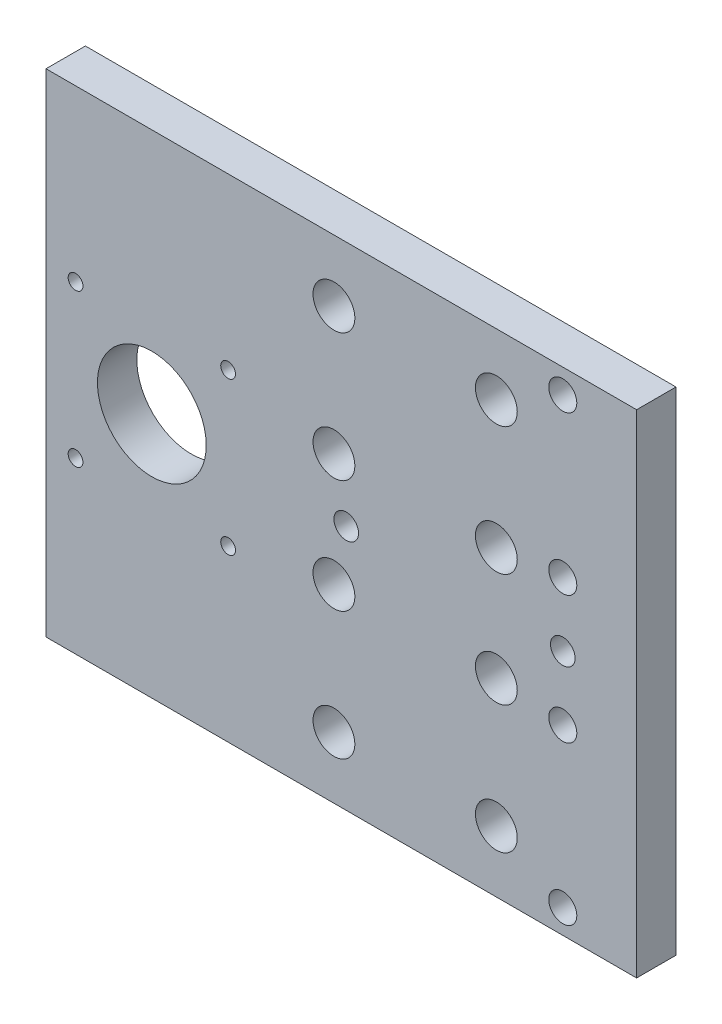
ISO-10303-21;
HEADER;
FILE_DESCRIPTION(('STEP AP214'),'2;1');
FILE_NAME('part.step','',(''),(''),'','','');
FILE_SCHEMA(('AUTOMOTIVE_DESIGN { 1 0 10303 214 1 1 1 1 }'));
ENDSEC;
DATA;
#1=APPLICATION_CONTEXT('core data for automotive mechanical design processes');
#2=APPLICATION_PROTOCOL_DEFINITION('international standard','automotive_design',2000,#1);
#3=PRODUCT_CONTEXT('',#1,'mechanical');
#4=PRODUCT('Part','Part','',(#3));
#5=PRODUCT_RELATED_PRODUCT_CATEGORY('part','',(#4));
#6=PRODUCT_DEFINITION_FORMATION('','',#4);
#7=PRODUCT_DEFINITION_CONTEXT('part definition',#1,'design');
#8=PRODUCT_DEFINITION('design','',#6,#7);
#9=PRODUCT_DEFINITION_SHAPE('','',#8);
#10=(LENGTH_UNIT() NAMED_UNIT(*) SI_UNIT(.MILLI.,.METRE.));
#11=(NAMED_UNIT(*) PLANE_ANGLE_UNIT() SI_UNIT($,.RADIAN.));
#12=(NAMED_UNIT(*) SI_UNIT($,.STERADIAN.) SOLID_ANGLE_UNIT());
#13=UNCERTAINTY_MEASURE_WITH_UNIT(LENGTH_MEASURE(1.E-05),#10,'distance_accuracy_value','');
#14=(GEOMETRIC_REPRESENTATION_CONTEXT(3) GLOBAL_UNCERTAINTY_ASSIGNED_CONTEXT((#13)) GLOBAL_UNIT_ASSIGNED_CONTEXT((#10,
#11,#12)) REPRESENTATION_CONTEXT('',''));
#15=CARTESIAN_POINT('',(0.,0.,0.));
#16=DIRECTION('',(0.,0.,1.));
#17=DIRECTION('',(1.,0.,0.));
#18=AXIS2_PLACEMENT_3D('',#15,#16,#17);
#19=CARTESIAN_POINT('',(-61.5,37.5,8.));
#20=DIRECTION('',(0.,0.,-1.));
#21=DIRECTION('',(-1.,0.,0.));
#22=AXIS2_PLACEMENT_3D('',#19,#20,#21);
#23=CYLINDRICAL_SURFACE('',#22,2.5);
#24=CARTESIAN_POINT('',(-61.5,37.5,0.));
#25=DIRECTION('',(0.,0.,1.));
#26=DIRECTION('',(1.,0.,0.));
#27=AXIS2_PLACEMENT_3D('',#24,#25,#26);
#28=CIRCLE('',#27,2.5);
#29=CARTESIAN_POINT('',(-59.,37.5,0.));
#30=VERTEX_POINT('',#29);
#31=EDGE_CURVE('E202',#30,#30,#28,.T.);
#32=ORIENTED_EDGE('',*,*,#31,.F.);
#33=EDGE_LOOP('',(#32));
#34=FACE_BOUND('',#33,.T.);
#35=CARTESIAN_POINT('',(-61.5,37.5,2.));
#36=DIRECTION('',(0.,0.,1.));
#37=DIRECTION('',(1.,0.,0.));
#38=AXIS2_PLACEMENT_3D('',#35,#36,#37);
#39=CIRCLE('',#38,2.5);
#40=CARTESIAN_POINT('',(-59.,37.5,2.));
#41=VERTEX_POINT('',#40);
#42=EDGE_CURVE('E39',#41,#41,#39,.T.);
#43=ORIENTED_EDGE('',*,*,#42,.T.);
#44=EDGE_LOOP('',(#43));
#45=FACE_BOUND('',#44,.T.);
#46=ADVANCED_FACE('F35',(#34,#45),#23,.F.);
#47=CARTESIAN_POINT('',(-28.5,37.5,8.));
#48=DIRECTION('',(0.,0.,-1.));
#49=DIRECTION('',(-1.,0.,0.));
#50=AXIS2_PLACEMENT_3D('',#47,#48,#49);
#51=CYLINDRICAL_SURFACE('',#50,2.5);
#52=CARTESIAN_POINT('',(-28.5,37.5,0.));
#53=DIRECTION('',(0.,0.,1.));
#54=DIRECTION('',(1.,0.,0.));
#55=AXIS2_PLACEMENT_3D('',#52,#53,#54);
#56=CIRCLE('',#55,2.5);
#57=CARTESIAN_POINT('',(-26.,37.5,0.));
#58=VERTEX_POINT('',#57);
#59=EDGE_CURVE('E199',#58,#58,#56,.T.);
#60=ORIENTED_EDGE('',*,*,#59,.F.);
#61=EDGE_LOOP('',(#60));
#62=FACE_BOUND('',#61,.T.);
#63=CARTESIAN_POINT('',(-28.5,37.5,2.));
#64=DIRECTION('',(0.,0.,1.));
#65=DIRECTION('',(1.,0.,0.));
#66=AXIS2_PLACEMENT_3D('',#63,#64,#65);
#67=CIRCLE('',#66,2.5);
#68=CARTESIAN_POINT('',(-26.,37.5,2.));
#69=VERTEX_POINT('',#68);
#70=EDGE_CURVE('E121',#69,#69,#67,.T.);
#71=ORIENTED_EDGE('',*,*,#70,.T.);
#72=EDGE_LOOP('',(#71));
#73=FACE_BOUND('',#72,.T.);
#74=ADVANCED_FACE('F251',(#62,#73),#51,.F.);
#75=CARTESIAN_POINT('',(-61.5,11.5,8.));
#76=DIRECTION('',(0.,0.,-1.));
#77=DIRECTION('',(-1.,0.,0.));
#78=AXIS2_PLACEMENT_3D('',#75,#76,#77);
#79=CYLINDRICAL_SURFACE('',#78,2.5);
#80=CARTESIAN_POINT('',(-61.5,11.5,0.));
#81=DIRECTION('',(0.,0.,1.));
#82=DIRECTION('',(1.,0.,0.));
#83=AXIS2_PLACEMENT_3D('',#80,#81,#82);
#84=CIRCLE('',#83,2.5);
#85=CARTESIAN_POINT('',(-59.,11.5,0.));
#86=VERTEX_POINT('',#85);
#87=EDGE_CURVE('E196',#86,#86,#84,.T.);
#88=ORIENTED_EDGE('',*,*,#87,.F.);
#89=EDGE_LOOP('',(#88));
#90=FACE_BOUND('',#89,.T.);
#91=CARTESIAN_POINT('',(-61.5,11.5,2.));
#92=DIRECTION('',(0.,0.,1.));
#93=DIRECTION('',(1.,0.,0.));
#94=AXIS2_PLACEMENT_3D('',#91,#92,#93);
#95=CIRCLE('',#94,2.5);
#96=CARTESIAN_POINT('',(-59.,11.5,2.));
#97=VERTEX_POINT('',#96);
#98=EDGE_CURVE('E119',#97,#97,#95,.T.);
#99=ORIENTED_EDGE('',*,*,#98,.T.);
#100=EDGE_LOOP('',(#99));
#101=FACE_BOUND('',#100,.T.);
#102=ADVANCED_FACE('F258',(#90,#101),#79,.F.);
#103=CARTESIAN_POINT('',(-28.5,11.5,8.));
#104=DIRECTION('',(0.,0.,-1.));
#105=DIRECTION('',(-1.,0.,0.));
#106=AXIS2_PLACEMENT_3D('',#103,#104,#105);
#107=CYLINDRICAL_SURFACE('',#106,2.5);
#108=CARTESIAN_POINT('',(-28.5,11.5,0.));
#109=DIRECTION('',(0.,0.,1.));
#110=DIRECTION('',(1.,0.,0.));
#111=AXIS2_PLACEMENT_3D('',#108,#109,#110);
#112=CIRCLE('',#111,2.5);
#113=CARTESIAN_POINT('',(-26.,11.5,0.));
#114=VERTEX_POINT('',#113);
#115=EDGE_CURVE('E193',#114,#114,#112,.T.);
#116=ORIENTED_EDGE('',*,*,#115,.F.);
#117=EDGE_LOOP('',(#116));
#118=FACE_BOUND('',#117,.T.);
#119=CARTESIAN_POINT('',(-28.5,11.5,2.));
#120=DIRECTION('',(0.,0.,1.));
#121=DIRECTION('',(1.,0.,0.));
#122=AXIS2_PLACEMENT_3D('',#119,#120,#121);
#123=CIRCLE('',#122,2.5);
#124=CARTESIAN_POINT('',(-26.,11.5,2.));
#125=VERTEX_POINT('',#124);
#126=EDGE_CURVE('E116',#125,#125,#123,.T.);
#127=ORIENTED_EDGE('',*,*,#126,.T.);
#128=EDGE_LOOP('',(#127));
#129=FACE_BOUND('',#128,.T.);
#130=ADVANCED_FACE('F349',(#118,#129),#107,.F.);
#131=CARTESIAN_POINT('',(-61.5,-11.5,8.));
#132=DIRECTION('',(0.,0.,-1.));
#133=DIRECTION('',(-1.,0.,0.));
#134=AXIS2_PLACEMENT_3D('',#131,#132,#133);
#135=CYLINDRICAL_SURFACE('',#134,2.5);
#136=CARTESIAN_POINT('',(-61.5,-11.5,0.));
#137=DIRECTION('',(0.,0.,1.));
#138=DIRECTION('',(1.,0.,0.));
#139=AXIS2_PLACEMENT_3D('',#136,#137,#138);
#140=CIRCLE('',#139,2.5);
#141=CARTESIAN_POINT('',(-59.,-11.5,0.));
#142=VERTEX_POINT('',#141);
#143=EDGE_CURVE('E190',#142,#142,#140,.T.);
#144=ORIENTED_EDGE('',*,*,#143,.F.);
#145=EDGE_LOOP('',(#144));
#146=FACE_BOUND('',#145,.T.);
#147=CARTESIAN_POINT('',(-61.5,-11.5,2.));
#148=DIRECTION('',(0.,0.,1.));
#149=DIRECTION('',(1.,0.,0.));
#150=AXIS2_PLACEMENT_3D('',#147,#148,#149);
#151=CIRCLE('',#150,2.5);
#152=CARTESIAN_POINT('',(-59.,-11.5,2.));
#153=VERTEX_POINT('',#152);
#154=EDGE_CURVE('E113',#153,#153,#151,.T.);
#155=ORIENTED_EDGE('',*,*,#154,.T.);
#156=EDGE_LOOP('',(#155));
#157=FACE_BOUND('',#156,.T.);
#158=ADVANCED_FACE('F345',(#146,#157),#135,.F.);
#159=CARTESIAN_POINT('',(-28.5,-11.5,8.));
#160=DIRECTION('',(0.,0.,-1.));
#161=DIRECTION('',(-1.,0.,0.));
#162=AXIS2_PLACEMENT_3D('',#159,#160,#161);
#163=CYLINDRICAL_SURFACE('',#162,2.5);
#164=CARTESIAN_POINT('',(-28.5,-11.5,0.));
#165=DIRECTION('',(0.,0.,1.));
#166=DIRECTION('',(1.,0.,0.));
#167=AXIS2_PLACEMENT_3D('',#164,#165,#166);
#168=CIRCLE('',#167,2.5);
#169=CARTESIAN_POINT('',(-26.,-11.5,0.));
#170=VERTEX_POINT('',#169);
#171=EDGE_CURVE('E187',#170,#170,#168,.T.);
#172=ORIENTED_EDGE('',*,*,#171,.F.);
#173=EDGE_LOOP('',(#172));
#174=FACE_BOUND('',#173,.T.);
#175=CARTESIAN_POINT('',(-28.5,-11.5,2.));
#176=DIRECTION('',(0.,0.,1.));
#177=DIRECTION('',(1.,0.,0.));
#178=AXIS2_PLACEMENT_3D('',#175,#176,#177);
#179=CIRCLE('',#178,2.5);
#180=CARTESIAN_POINT('',(-26.,-11.5,2.));
#181=VERTEX_POINT('',#180);
#182=EDGE_CURVE('E110',#181,#181,#179,.T.);
#183=ORIENTED_EDGE('',*,*,#182,.T.);
#184=EDGE_LOOP('',(#183));
#185=FACE_BOUND('',#184,.T.);
#186=ADVANCED_FACE('F341',(#174,#185),#163,.F.);
#187=CARTESIAN_POINT('',(-28.5,-37.5,8.));
#188=DIRECTION('',(0.,0.,-1.));
#189=DIRECTION('',(-1.,0.,0.));
#190=AXIS2_PLACEMENT_3D('',#187,#188,#189);
#191=CYLINDRICAL_SURFACE('',#190,2.5);
#192=CARTESIAN_POINT('',(-28.5,-37.5,0.));
#193=DIRECTION('',(0.,0.,1.));
#194=DIRECTION('',(1.,0.,0.));
#195=AXIS2_PLACEMENT_3D('',#192,#193,#194);
#196=CIRCLE('',#195,2.5);
#197=CARTESIAN_POINT('',(-26.,-37.5,0.));
#198=VERTEX_POINT('',#197);
#199=EDGE_CURVE('E184',#198,#198,#196,.T.);
#200=ORIENTED_EDGE('',*,*,#199,.F.);
#201=EDGE_LOOP('',(#200));
#202=FACE_BOUND('',#201,.T.);
#203=CARTESIAN_POINT('',(-28.5,-37.5,2.));
#204=DIRECTION('',(0.,0.,1.));
#205=DIRECTION('',(1.,0.,0.));
#206=AXIS2_PLACEMENT_3D('',#203,#204,#205);
#207=CIRCLE('',#206,2.5);
#208=CARTESIAN_POINT('',(-26.,-37.5,2.));
#209=VERTEX_POINT('',#208);
#210=EDGE_CURVE('E106',#209,#209,#207,.T.);
#211=ORIENTED_EDGE('',*,*,#210,.T.);
#212=EDGE_LOOP('',(#211));
#213=FACE_BOUND('',#212,.T.);
#214=ADVANCED_FACE('F337',(#202,#213),#191,.F.);
#215=CARTESIAN_POINT('',(-61.5,-37.5,8.));
#216=DIRECTION('',(0.,0.,-1.));
#217=DIRECTION('',(-1.,0.,0.));
#218=AXIS2_PLACEMENT_3D('',#215,#216,#217);
#219=CYLINDRICAL_SURFACE('',#218,2.5);
#220=CARTESIAN_POINT('',(-61.5,-37.5,0.));
#221=DIRECTION('',(0.,0.,1.));
#222=DIRECTION('',(1.,0.,0.));
#223=AXIS2_PLACEMENT_3D('',#220,#221,#222);
#224=CIRCLE('',#223,2.5);
#225=CARTESIAN_POINT('',(-59.,-37.5,0.));
#226=VERTEX_POINT('',#225);
#227=EDGE_CURVE('E179',#226,#226,#224,.T.);
#228=ORIENTED_EDGE('',*,*,#227,.F.);
#229=EDGE_LOOP('',(#228));
#230=FACE_BOUND('',#229,.T.);
#231=CARTESIAN_POINT('',(-61.5,-37.5,2.));
#232=DIRECTION('',(0.,0.,1.));
#233=DIRECTION('',(1.,0.,0.));
#234=AXIS2_PLACEMENT_3D('',#231,#232,#233);
#235=CIRCLE('',#234,2.5);
#236=CARTESIAN_POINT('',(-59.,-37.5,2.));
#237=VERTEX_POINT('',#236);
#238=EDGE_CURVE('E103',#237,#237,#235,.T.);
#239=ORIENTED_EDGE('',*,*,#238,.T.);
#240=EDGE_LOOP('',(#239));
#241=FACE_BOUND('',#240,.T.);
#242=ADVANCED_FACE('F334',(#230,#241),#219,.F.);
#243=CARTESIAN_POINT('',(0.,0.,8.));
#244=DIRECTION('',(0.,0.,1.));
#245=DIRECTION('',(1.,0.,0.));
#246=AXIS2_PLACEMENT_3D('',#243,#244,#245);
#247=PLANE('',#246);
#248=CARTESIAN_POINT('',(-15.,0.,8.));
#249=DIRECTION('',(0.,0.,1.));
#250=DIRECTION('',(1.,0.,0.));
#251=AXIS2_PLACEMENT_3D('',#248,#249,#250);
#252=CIRCLE('',#251,2.5);
#253=CARTESIAN_POINT('',(-12.5,0.,8.));
#254=VERTEX_POINT('',#253);
#255=EDGE_CURVE('E414',#254,#254,#252,.T.);
#256=ORIENTED_EDGE('',*,*,#255,.F.);
#257=EDGE_LOOP('',(#256));
#258=FACE_BOUND('',#257,.T.);
#259=CARTESIAN_POINT('',(-59.,0.,8.));
#260=DIRECTION('',(0.,0.,1.));
#261=DIRECTION('',(1.,0.,0.));
#262=AXIS2_PLACEMENT_3D('',#259,#260,#261);
#263=CIRCLE('',#262,2.5);
#264=CARTESIAN_POINT('',(-56.5,0.,8.));
#265=VERTEX_POINT('',#264);
#266=EDGE_CURVE('E408',#265,#265,#263,.T.);
#267=ORIENTED_EDGE('',*,*,#266,.F.);
#268=EDGE_LOOP('',(#267));
#269=FACE_BOUND('',#268,.T.);
#270=CARTESIAN_POINT('',(-61.5,-11.5,8.));
#271=DIRECTION('',(0.,0.,1.));
#272=DIRECTION('',(1.,0.,0.));
#273=AXIS2_PLACEMENT_3D('',#270,#271,#272);
#274=CIRCLE('',#273,4.25000000000001);
#275=CARTESIAN_POINT('',(-57.25,-11.5,8.));
#276=VERTEX_POINT('',#275);
#277=EDGE_CURVE('E378',#276,#276,#274,.T.);
#278=ORIENTED_EDGE('',*,*,#277,.F.);
#279=EDGE_LOOP('',(#278));
#280=FACE_BOUND('',#279,.T.);
#281=CARTESIAN_POINT('',(-28.5,11.5,8.));
#282=DIRECTION('',(0.,0.,1.));
#283=DIRECTION('',(1.,0.,0.));
#284=AXIS2_PLACEMENT_3D('',#281,#282,#283);
#285=CIRCLE('',#284,4.25);
#286=CARTESIAN_POINT('',(-24.25,11.5,8.));
#287=VERTEX_POINT('',#286);
#288=EDGE_CURVE('E385',#287,#287,#285,.T.);
#289=ORIENTED_EDGE('',*,*,#288,.F.);
#290=EDGE_LOOP('',(#289));
#291=FACE_BOUND('',#290,.T.);
#292=CARTESIAN_POINT('',(-61.5,11.5,8.));
#293=DIRECTION('',(0.,0.,1.));
#294=DIRECTION('',(1.,0.,0.));
#295=AXIS2_PLACEMENT_3D('',#292,#293,#294);
#296=CIRCLE('',#295,4.25000000000001);
#297=CARTESIAN_POINT('',(-57.25,11.5,8.));
#298=VERTEX_POINT('',#297);
#299=EDGE_CURVE('E144',#298,#298,#296,.T.);
#300=ORIENTED_EDGE('',*,*,#299,.F.);
#301=EDGE_LOOP('',(#300));
#302=FACE_BOUND('',#301,.T.);
#303=CARTESIAN_POINT('',(-28.5,37.5,8.));
#304=DIRECTION('',(0.,0.,1.));
#305=DIRECTION('',(1.,0.,0.));
#306=AXIS2_PLACEMENT_3D('',#303,#304,#305);
#307=CIRCLE('',#306,4.25);
#308=CARTESIAN_POINT('',(-24.25,37.5,8.));
#309=VERTEX_POINT('',#308);
#310=EDGE_CURVE('E370',#309,#309,#307,.T.);
#311=ORIENTED_EDGE('',*,*,#310,.F.);
#312=EDGE_LOOP('',(#311));
#313=FACE_BOUND('',#312,.T.);
#314=CARTESIAN_POINT('',(-28.5,-37.5,8.));
#315=DIRECTION('',(0.,0.,1.));
#316=DIRECTION('',(1.,0.,0.));
#317=AXIS2_PLACEMENT_3D('',#314,#315,#316);
#318=CIRCLE('',#317,4.25);
#319=CARTESIAN_POINT('',(-24.25,-37.5,8.));
#320=VERTEX_POINT('',#319);
#321=EDGE_CURVE('E402',#320,#320,#318,.T.);
#322=ORIENTED_EDGE('',*,*,#321,.F.);
#323=EDGE_LOOP('',(#322));
#324=FACE_BOUND('',#323,.T.);
#325=CARTESIAN_POINT('',(-61.5,-37.5,8.));
#326=DIRECTION('',(0.,0.,1.));
#327=DIRECTION('',(1.,0.,0.));
#328=AXIS2_PLACEMENT_3D('',#325,#326,#327);
#329=CIRCLE('',#328,4.25000000000001);
#330=CARTESIAN_POINT('',(-57.25,-37.5,8.));
#331=VERTEX_POINT('',#330);
#332=EDGE_CURVE('E390',#331,#331,#329,.T.);
#333=ORIENTED_EDGE('',*,*,#332,.F.);
#334=EDGE_LOOP('',(#333));
#335=FACE_BOUND('',#334,.T.);
#336=CARTESIAN_POINT('',(-28.5,-11.5,8.));
#337=DIRECTION('',(0.,0.,1.));
#338=DIRECTION('',(1.,0.,0.));
#339=AXIS2_PLACEMENT_3D('',#336,#337,#338);
#340=CIRCLE('',#339,4.25);
#341=CARTESIAN_POINT('',(-24.25,-11.5,8.));
#342=VERTEX_POINT('',#341);
#343=EDGE_CURVE('E397',#342,#342,#340,.T.);
#344=ORIENTED_EDGE('',*,*,#343,.F.);
#345=EDGE_LOOP('',(#344));
#346=FACE_BOUND('',#345,.T.);
#347=CARTESIAN_POINT('',(-61.5,37.5,8.));
#348=DIRECTION('',(0.,0.,1.));
#349=DIRECTION('',(1.,0.,0.));
#350=AXIS2_PLACEMENT_3D('',#347,#348,#349);
#351=CIRCLE('',#350,4.25000000000001);
#352=CARTESIAN_POINT('',(-57.25,37.5,8.));
#353=VERTEX_POINT('',#352);
#354=EDGE_CURVE('E138',#353,#353,#351,.T.);
#355=ORIENTED_EDGE('',*,*,#354,.F.);
#356=EDGE_LOOP('',(#355));
#357=FACE_BOUND('',#356,.T.);
#358=DIRECTION('',(1.,0.,0.));
#359=VECTOR('',#358,1.);
#360=CARTESIAN_POINT('',(-139.94109970655,50.,8.));
#361=LINE('',#360,#359);
#362=CARTESIAN_POINT('',(-120.,50.,8.));
#363=VERTEX_POINT('',#362);
#364=CARTESIAN_POINT('',(0.,50.,8.));
#365=VERTEX_POINT('',#364);
#366=EDGE_CURVE('E52',#363,#365,#361,.T.);
#367=ORIENTED_EDGE('',*,*,#366,.F.);
#368=DIRECTION('',(0.,-1.,0.));
#369=VECTOR('',#368,1.);
#370=CARTESIAN_POINT('',(-120.,60.,8.));
#371=LINE('',#370,#369);
#372=CARTESIAN_POINT('',(-120.,-50.,8.));
#373=VERTEX_POINT('',#372);
#374=EDGE_CURVE('E90',#363,#373,#371,.T.);
#375=ORIENTED_EDGE('',*,*,#374,.T.);
#376=DIRECTION('',(-1.,0.,0.));
#377=VECTOR('',#376,1.);
#378=CARTESIAN_POINT('',(-139.94109970655,-50.,8.));
#379=LINE('',#378,#377);
#380=CARTESIAN_POINT('',(0.,-50.,8.));
#381=VERTEX_POINT('',#380);
#382=EDGE_CURVE('E76',#381,#373,#379,.T.);
#383=ORIENTED_EDGE('',*,*,#382,.F.);
#384=DIRECTION('',(0.,1.,0.));
#385=VECTOR('',#384,1.);
#386=CARTESIAN_POINT('',(0.,-60.,8.));
#387=LINE('',#386,#385);
#388=EDGE_CURVE('E82',#381,#365,#387,.T.);
#389=ORIENTED_EDGE('',*,*,#388,.T.);
#390=EDGE_LOOP('',(#367,#375,#383,#389));
#391=FACE_BOUND('',#390,.T.);
#392=CARTESIAN_POINT('',(-15.,-13.,8.));
#393=DIRECTION('',(0.,0.,1.));
#394=DIRECTION('',(1.,0.,0.));
#395=AXIS2_PLACEMENT_3D('',#392,#393,#394);
#396=CIRCLE('',#395,2.85);
#397=CARTESIAN_POINT('',(-12.15,-13.,8.));
#398=VERTEX_POINT('',#397);
#399=EDGE_CURVE('E164',#398,#398,#396,.T.);
#400=ORIENTED_EDGE('',*,*,#399,.F.);
#401=EDGE_LOOP('',(#400));
#402=FACE_BOUND('',#401,.T.);
#403=CARTESIAN_POINT('',(-15.,45.1,8.));
#404=DIRECTION('',(0.,0.,1.));
#405=DIRECTION('',(1.,0.,0.));
#406=AXIS2_PLACEMENT_3D('',#403,#404,#405);
#407=CIRCLE('',#406,2.85);
#408=CARTESIAN_POINT('',(-12.15,45.1,8.));
#409=VERTEX_POINT('',#408);
#410=EDGE_CURVE('E176',#409,#409,#407,.T.);
#411=ORIENTED_EDGE('',*,*,#410,.F.);
#412=EDGE_LOOP('',(#411));
#413=FACE_BOUND('',#412,.T.);
#414=CARTESIAN_POINT('',(-114.,-15.5,8.));
#415=DIRECTION('',(0.,0.,1.));
#416=DIRECTION('',(1.,0.,0.));
#417=AXIS2_PLACEMENT_3D('',#414,#415,#416);
#418=CIRCLE('',#417,1.5);
#419=CARTESIAN_POINT('',(-112.5,-15.5,8.));
#420=VERTEX_POINT('',#419);
#421=EDGE_CURVE('E212',#420,#420,#418,.T.);
#422=ORIENTED_EDGE('',*,*,#421,.F.);
#423=EDGE_LOOP('',(#422));
#424=FACE_BOUND('',#423,.T.);
#425=CARTESIAN_POINT('',(-83.,15.5,8.));
#426=DIRECTION('',(0.,0.,1.));
#427=DIRECTION('',(1.,0.,0.));
#428=AXIS2_PLACEMENT_3D('',#425,#426,#427);
#429=CIRCLE('',#428,1.5);
#430=CARTESIAN_POINT('',(-81.5,15.5,8.));
#431=VERTEX_POINT('',#430);
#432=EDGE_CURVE('E224',#431,#431,#429,.T.);
#433=ORIENTED_EDGE('',*,*,#432,.F.);
#434=EDGE_LOOP('',(#433));
#435=FACE_BOUND('',#434,.T.);
#436=CARTESIAN_POINT('',(-98.5,0.,8.));
#437=DIRECTION('',(0.,0.,1.));
#438=DIRECTION('',(1.,0.,0.));
#439=AXIS2_PLACEMENT_3D('',#436,#437,#438);
#440=CIRCLE('',#439,11.05);
#441=CARTESIAN_POINT('',(-87.45,0.,8.));
#442=VERTEX_POINT('',#441);
#443=EDGE_CURVE('E101',#442,#442,#440,.T.);
#444=ORIENTED_EDGE('',*,*,#443,.F.);
#445=EDGE_LOOP('',(#444));
#446=FACE_BOUND('',#445,.T.);
#447=CARTESIAN_POINT('',(-114.,15.5,8.));
#448=DIRECTION('',(0.,0.,1.));
#449=DIRECTION('',(1.,0.,0.));
#450=AXIS2_PLACEMENT_3D('',#447,#448,#449);
#451=CIRCLE('',#450,1.5);
#452=CARTESIAN_POINT('',(-112.5,15.5,8.));
#453=VERTEX_POINT('',#452);
#454=EDGE_CURVE('E218',#453,#453,#451,.T.);
#455=ORIENTED_EDGE('',*,*,#454,.F.);
#456=EDGE_LOOP('',(#455));
#457=FACE_BOUND('',#456,.T.);
#458=CARTESIAN_POINT('',(-83.,-15.5,8.));
#459=DIRECTION('',(0.,0.,1.));
#460=DIRECTION('',(1.,0.,0.));
#461=AXIS2_PLACEMENT_3D('',#458,#459,#460);
#462=CIRCLE('',#461,1.5);
#463=CARTESIAN_POINT('',(-81.5,-15.5,8.));
#464=VERTEX_POINT('',#463);
#465=EDGE_CURVE('E206',#464,#464,#462,.T.);
#466=ORIENTED_EDGE('',*,*,#465,.F.);
#467=EDGE_LOOP('',(#466));
#468=FACE_BOUND('',#467,.T.);
#469=CARTESIAN_POINT('',(-15.,13.,8.));
#470=DIRECTION('',(0.,0.,1.));
#471=DIRECTION('',(1.,0.,0.));
#472=AXIS2_PLACEMENT_3D('',#469,#470,#471);
#473=CIRCLE('',#472,2.85);
#474=CARTESIAN_POINT('',(-12.15,13.,8.));
#475=VERTEX_POINT('',#474);
#476=EDGE_CURVE('E170',#475,#475,#473,.T.);
#477=ORIENTED_EDGE('',*,*,#476,.F.);
#478=EDGE_LOOP('',(#477));
#479=FACE_BOUND('',#478,.T.);
#480=CARTESIAN_POINT('',(-15.,-45.1,8.));
#481=DIRECTION('',(0.,0.,1.));
#482=DIRECTION('',(1.,0.,0.));
#483=AXIS2_PLACEMENT_3D('',#480,#481,#482);
#484=CIRCLE('',#483,2.85);
#485=CARTESIAN_POINT('',(-12.15,-45.1,8.));
#486=VERTEX_POINT('',#485);
#487=EDGE_CURVE('E158',#486,#486,#484,.T.);
#488=ORIENTED_EDGE('',*,*,#487,.F.);
#489=EDGE_LOOP('',(#488));
#490=FACE_BOUND('',#489,.T.);
#491=ADVANCED_FACE('F87',(#258,#269,#280,#291,#302,#313,#324,#335,#346,#357,#391,#402,#413,#424,
#435,#446,#457,#468,#479,#490),#247,.T.);
#492=CARTESIAN_POINT('',(0.,0.,0.));
#493=DIRECTION('',(0.,0.,1.));
#494=DIRECTION('',(1.,0.,0.));
#495=AXIS2_PLACEMENT_3D('',#492,#493,#494);
#496=PLANE('',#495);
#497=CARTESIAN_POINT('',(-15.,0.,0.));
#498=DIRECTION('',(0.,0.,1.));
#499=DIRECTION('',(1.,0.,0.));
#500=AXIS2_PLACEMENT_3D('',#497,#498,#499);
#501=CIRCLE('',#500,2.5);
#502=CARTESIAN_POINT('',(-12.5,0.,0.));
#503=VERTEX_POINT('',#502);
#504=EDGE_CURVE('E405',#503,#503,#501,.T.);
#505=ORIENTED_EDGE('',*,*,#504,.T.);
#506=EDGE_LOOP('',(#505));
#507=FACE_BOUND('',#506,.T.);
#508=CARTESIAN_POINT('',(-59.,0.,0.));
#509=DIRECTION('',(0.,0.,1.));
#510=DIRECTION('',(1.,0.,0.));
#511=AXIS2_PLACEMENT_3D('',#508,#509,#510);
#512=CIRCLE('',#511,2.5);
#513=CARTESIAN_POINT('',(-56.5,0.,0.));
#514=VERTEX_POINT('',#513);
#515=EDGE_CURVE('E411',#514,#514,#512,.T.);
#516=ORIENTED_EDGE('',*,*,#515,.T.);
#517=EDGE_LOOP('',(#516));
#518=FACE_BOUND('',#517,.T.);
#519=DIRECTION('',(0.,-1.,0.));
#520=VECTOR('',#519,1.);
#521=CARTESIAN_POINT('',(-120.,60.,0.));
#522=LINE('',#521,#520);
#523=CARTESIAN_POINT('',(-120.,50.,0.));
#524=VERTEX_POINT('',#523);
#525=CARTESIAN_POINT('',(-120.,-50.,0.));
#526=VERTEX_POINT('',#525);
#527=EDGE_CURVE('E98',#524,#526,#522,.T.);
#528=ORIENTED_EDGE('',*,*,#527,.F.);
#529=DIRECTION('',(1.,0.,0.));
#530=VECTOR('',#529,1.);
#531=CARTESIAN_POINT('',(0.,50.,0.));
#532=LINE('',#531,#530);
#533=CARTESIAN_POINT('',(0.,50.,0.));
#534=VERTEX_POINT('',#533);
#535=EDGE_CURVE('E151',#524,#534,#532,.T.);
#536=ORIENTED_EDGE('',*,*,#535,.T.);
#537=DIRECTION('',(0.,1.,0.));
#538=VECTOR('',#537,1.);
#539=CARTESIAN_POINT('',(0.,-60.,0.));
#540=LINE('',#539,#538);
#541=CARTESIAN_POINT('',(0.,-50.,0.));
#542=VERTEX_POINT('',#541);
#543=EDGE_CURVE('E94',#542,#534,#540,.T.);
#544=ORIENTED_EDGE('',*,*,#543,.F.);
#545=DIRECTION('',(-1.,0.,0.));
#546=VECTOR('',#545,1.);
#547=CARTESIAN_POINT('',(0.,-50.,0.));
#548=LINE('',#547,#546);
#549=EDGE_CURVE('E59',#542,#526,#548,.T.);
#550=ORIENTED_EDGE('',*,*,#549,.T.);
#551=EDGE_LOOP('',(#528,#536,#544,#550));
#552=FACE_BOUND('',#551,.T.);
#553=CARTESIAN_POINT('',(-98.5,0.,0.));
#554=DIRECTION('',(0.,0.,1.));
#555=DIRECTION('',(1.,0.,0.));
#556=AXIS2_PLACEMENT_3D('',#553,#554,#555);
#557=CIRCLE('',#556,11.05);
#558=CARTESIAN_POINT('',(-87.45,0.,0.));
#559=VERTEX_POINT('',#558);
#560=EDGE_CURVE('E227',#559,#559,#557,.T.);
#561=ORIENTED_EDGE('',*,*,#560,.T.);
#562=EDGE_LOOP('',(#561));
#563=FACE_BOUND('',#562,.T.);
#564=CARTESIAN_POINT('',(-83.,15.5,0.));
#565=DIRECTION('',(0.,0.,1.));
#566=DIRECTION('',(1.,0.,0.));
#567=AXIS2_PLACEMENT_3D('',#564,#565,#566);
#568=CIRCLE('',#567,1.5);
#569=CARTESIAN_POINT('',(-81.5,15.5,0.));
#570=VERTEX_POINT('',#569);
#571=EDGE_CURVE('E221',#570,#570,#568,.T.);
#572=ORIENTED_EDGE('',*,*,#571,.T.);
#573=EDGE_LOOP('',(#572));
#574=FACE_BOUND('',#573,.T.);
#575=CARTESIAN_POINT('',(-114.,15.5,0.));
#576=DIRECTION('',(0.,0.,1.));
#577=DIRECTION('',(1.,0.,0.));
#578=AXIS2_PLACEMENT_3D('',#575,#576,#577);
#579=CIRCLE('',#578,1.5);
#580=CARTESIAN_POINT('',(-112.5,15.5,0.));
#581=VERTEX_POINT('',#580);
#582=EDGE_CURVE('E215',#581,#581,#579,.T.);
#583=ORIENTED_EDGE('',*,*,#582,.T.);
#584=EDGE_LOOP('',(#583));
#585=FACE_BOUND('',#584,.T.);
#586=CARTESIAN_POINT('',(-114.,-15.5,0.));
#587=DIRECTION('',(0.,0.,1.));
#588=DIRECTION('',(1.,0.,0.));
#589=AXIS2_PLACEMENT_3D('',#586,#587,#588);
#590=CIRCLE('',#589,1.5);
#591=CARTESIAN_POINT('',(-112.5,-15.5,0.));
#592=VERTEX_POINT('',#591);
#593=EDGE_CURVE('E209',#592,#592,#590,.T.);
#594=ORIENTED_EDGE('',*,*,#593,.T.);
#595=EDGE_LOOP('',(#594));
#596=FACE_BOUND('',#595,.T.);
#597=CARTESIAN_POINT('',(-83.,-15.5,0.));
#598=DIRECTION('',(0.,0.,1.));
#599=DIRECTION('',(1.,0.,0.));
#600=AXIS2_PLACEMENT_3D('',#597,#598,#599);
#601=CIRCLE('',#600,1.5);
#602=CARTESIAN_POINT('',(-81.5,-15.5,0.));
#603=VERTEX_POINT('',#602);
#604=EDGE_CURVE('E205',#603,#603,#601,.T.);
#605=ORIENTED_EDGE('',*,*,#604,.T.);
#606=EDGE_LOOP('',(#605));
#607=FACE_BOUND('',#606,.T.);
#608=ORIENTED_EDGE('',*,*,#31,.T.);
#609=EDGE_LOOP('',(#608));
#610=FACE_BOUND('',#609,.T.);
#611=ORIENTED_EDGE('',*,*,#59,.T.);
#612=EDGE_LOOP('',(#611));
#613=FACE_BOUND('',#612,.T.);
#614=ORIENTED_EDGE('',*,*,#87,.T.);
#615=EDGE_LOOP('',(#614));
#616=FACE_BOUND('',#615,.T.);
#617=ORIENTED_EDGE('',*,*,#115,.T.);
#618=EDGE_LOOP('',(#617));
#619=FACE_BOUND('',#618,.T.);
#620=ORIENTED_EDGE('',*,*,#143,.T.);
#621=EDGE_LOOP('',(#620));
#622=FACE_BOUND('',#621,.T.);
#623=ORIENTED_EDGE('',*,*,#171,.T.);
#624=EDGE_LOOP('',(#623));
#625=FACE_BOUND('',#624,.T.);
#626=ORIENTED_EDGE('',*,*,#199,.T.);
#627=EDGE_LOOP('',(#626));
#628=FACE_BOUND('',#627,.T.);
#629=ORIENTED_EDGE('',*,*,#227,.T.);
#630=EDGE_LOOP('',(#629));
#631=FACE_BOUND('',#630,.T.);
#632=CARTESIAN_POINT('',(-15.,45.1,0.));
#633=DIRECTION('',(0.,0.,1.));
#634=DIRECTION('',(1.,0.,0.));
#635=AXIS2_PLACEMENT_3D('',#632,#633,#634);
#636=CIRCLE('',#635,2.85);
#637=CARTESIAN_POINT('',(-12.15,45.1,0.));
#638=VERTEX_POINT('',#637);
#639=EDGE_CURVE('E173',#638,#638,#636,.T.);
#640=ORIENTED_EDGE('',*,*,#639,.T.);
#641=EDGE_LOOP('',(#640));
#642=FACE_BOUND('',#641,.T.);
#643=CARTESIAN_POINT('',(-15.,13.,0.));
#644=DIRECTION('',(0.,0.,1.));
#645=DIRECTION('',(1.,0.,0.));
#646=AXIS2_PLACEMENT_3D('',#643,#644,#645);
#647=CIRCLE('',#646,2.85);
#648=CARTESIAN_POINT('',(-12.15,13.,0.));
#649=VERTEX_POINT('',#648);
#650=EDGE_CURVE('E167',#649,#649,#647,.T.);
#651=ORIENTED_EDGE('',*,*,#650,.T.);
#652=EDGE_LOOP('',(#651));
#653=FACE_BOUND('',#652,.T.);
#654=CARTESIAN_POINT('',(-15.,-13.,0.));
#655=DIRECTION('',(0.,0.,1.));
#656=DIRECTION('',(1.,0.,0.));
#657=AXIS2_PLACEMENT_3D('',#654,#655,#656);
#658=CIRCLE('',#657,2.85);
#659=CARTESIAN_POINT('',(-12.15,-13.,0.));
#660=VERTEX_POINT('',#659);
#661=EDGE_CURVE('E161',#660,#660,#658,.T.);
#662=ORIENTED_EDGE('',*,*,#661,.T.);
#663=EDGE_LOOP('',(#662));
#664=FACE_BOUND('',#663,.T.);
#665=CARTESIAN_POINT('',(-15.,-45.1,0.));
#666=DIRECTION('',(0.,0.,1.));
#667=DIRECTION('',(1.,0.,0.));
#668=AXIS2_PLACEMENT_3D('',#665,#666,#667);
#669=CIRCLE('',#668,2.85);
#670=CARTESIAN_POINT('',(-12.15,-45.1,0.));
#671=VERTEX_POINT('',#670);
#672=EDGE_CURVE('E157',#671,#671,#669,.T.);
#673=ORIENTED_EDGE('',*,*,#672,.T.);
#674=EDGE_LOOP('',(#673));
#675=FACE_BOUND('',#674,.T.);
#676=ADVANCED_FACE('F234',(#507,#518,#552,#563,#574,#585,#596,#607,#610,#613,#616,#619,#622,
#625,#628,#631,#642,#653,#664,#675),#496,.F.);
#677=CARTESIAN_POINT('',(-120.,60.,8.));
#678=DIRECTION('',(1.,0.,0.));
#679=DIRECTION('',(0.,1.,0.));
#680=AXIS2_PLACEMENT_3D('',#677,#678,#679);
#681=PLANE('',#680);
#682=ORIENTED_EDGE('',*,*,#374,.F.);
#683=DIRECTION('',(0.,0.,-1.));
#684=VECTOR('',#683,1.);
#685=CARTESIAN_POINT('',(-120.,50.,8.));
#686=LINE('',#685,#684);
#687=EDGE_CURVE('E154',#363,#524,#686,.T.);
#688=ORIENTED_EDGE('',*,*,#687,.T.);
#689=ORIENTED_EDGE('',*,*,#527,.T.);
#690=DIRECTION('',(0.,0.,1.));
#691=VECTOR('',#690,1.);
#692=CARTESIAN_POINT('',(-120.,-50.,8.));
#693=LINE('',#692,#691);
#694=EDGE_CURVE('E149',#526,#373,#693,.T.);
#695=ORIENTED_EDGE('',*,*,#694,.T.);
#696=EDGE_LOOP('',(#682,#688,#689,#695));
#697=FACE_BOUND('',#696,.T.);
#698=ADVANCED_FACE('F37',(#697),#681,.F.);
#699=CARTESIAN_POINT('',(0.,-60.,8.));
#700=DIRECTION('',(-1.,0.,0.));
#701=DIRECTION('',(0.,0.,1.));
#702=AXIS2_PLACEMENT_3D('',#699,#700,#701);
#703=PLANE('',#702);
#704=ORIENTED_EDGE('',*,*,#543,.T.);
#705=DIRECTION('',(0.,0.,1.));
#706=VECTOR('',#705,1.);
#707=CARTESIAN_POINT('',(0.,50.,8.));
#708=LINE('',#707,#706);
#709=EDGE_CURVE('E11',#534,#365,#708,.T.);
#710=ORIENTED_EDGE('',*,*,#709,.T.);
#711=ORIENTED_EDGE('',*,*,#388,.F.);
#712=DIRECTION('',(0.,0.,-1.));
#713=VECTOR('',#712,1.);
#714=CARTESIAN_POINT('',(0.,-50.,8.));
#715=LINE('',#714,#713);
#716=EDGE_CURVE('E44',#381,#542,#715,.T.);
#717=ORIENTED_EDGE('',*,*,#716,.T.);
#718=EDGE_LOOP('',(#704,#710,#711,#717));
#719=FACE_BOUND('',#718,.T.);
#720=ADVANCED_FACE('F92',(#719),#703,.F.);
#721=CARTESIAN_POINT('',(-98.5,0.,8.));
#722=DIRECTION('',(0.,0.,-1.));
#723=DIRECTION('',(-1.,0.,0.));
#724=AXIS2_PLACEMENT_3D('',#721,#722,#723);
#725=CYLINDRICAL_SURFACE('',#724,11.05);
#726=ORIENTED_EDGE('',*,*,#443,.T.);
#727=EDGE_LOOP('',(#726));
#728=FACE_BOUND('',#727,.T.);
#729=ORIENTED_EDGE('',*,*,#560,.F.);
#730=EDGE_LOOP('',(#729));
#731=FACE_BOUND('',#730,.T.);
#732=ADVANCED_FACE('F237',(#728,#731),#725,.F.);
#733=CARTESIAN_POINT('',(-83.,15.5,8.));
#734=DIRECTION('',(0.,0.,-1.));
#735=DIRECTION('',(-1.,0.,0.));
#736=AXIS2_PLACEMENT_3D('',#733,#734,#735);
#737=CYLINDRICAL_SURFACE('',#736,1.5);
#738=ORIENTED_EDGE('',*,*,#432,.T.);
#739=EDGE_LOOP('',(#738));
#740=FACE_BOUND('',#739,.T.);
#741=ORIENTED_EDGE('',*,*,#571,.F.);
#742=EDGE_LOOP('',(#741));
#743=FACE_BOUND('',#742,.T.);
#744=ADVANCED_FACE('F239',(#740,#743),#737,.F.);
#745=CARTESIAN_POINT('',(-114.,15.5,8.));
#746=DIRECTION('',(0.,0.,-1.));
#747=DIRECTION('',(-1.,0.,0.));
#748=AXIS2_PLACEMENT_3D('',#745,#746,#747);
#749=CYLINDRICAL_SURFACE('',#748,1.5);
#750=ORIENTED_EDGE('',*,*,#454,.T.);
#751=EDGE_LOOP('',(#750));
#752=FACE_BOUND('',#751,.T.);
#753=ORIENTED_EDGE('',*,*,#582,.F.);
#754=EDGE_LOOP('',(#753));
#755=FACE_BOUND('',#754,.T.);
#756=ADVANCED_FACE('F246',(#752,#755),#749,.F.);
#757=CARTESIAN_POINT('',(-114.,-15.5,8.));
#758=DIRECTION('',(0.,0.,-1.));
#759=DIRECTION('',(-1.,0.,0.));
#760=AXIS2_PLACEMENT_3D('',#757,#758,#759);
#761=CYLINDRICAL_SURFACE('',#760,1.5);
#762=ORIENTED_EDGE('',*,*,#421,.T.);
#763=EDGE_LOOP('',(#762));
#764=FACE_BOUND('',#763,.T.);
#765=ORIENTED_EDGE('',*,*,#593,.F.);
#766=EDGE_LOOP('',(#765));
#767=FACE_BOUND('',#766,.T.);
#768=ADVANCED_FACE('F268',(#764,#767),#761,.F.);
#769=CARTESIAN_POINT('',(-83.,-15.5,8.));
#770=DIRECTION('',(0.,0.,-1.));
#771=DIRECTION('',(-1.,0.,0.));
#772=AXIS2_PLACEMENT_3D('',#769,#770,#771);
#773=CYLINDRICAL_SURFACE('',#772,1.5);
#774=ORIENTED_EDGE('',*,*,#465,.T.);
#775=EDGE_LOOP('',(#774));
#776=FACE_BOUND('',#775,.T.);
#777=ORIENTED_EDGE('',*,*,#604,.F.);
#778=EDGE_LOOP('',(#777));
#779=FACE_BOUND('',#778,.T.);
#780=ADVANCED_FACE('F264',(#776,#779),#773,.F.);
#781=CARTESIAN_POINT('',(-15.,45.1,8.));
#782=DIRECTION('',(0.,0.,-1.));
#783=DIRECTION('',(-1.,0.,0.));
#784=AXIS2_PLACEMENT_3D('',#781,#782,#783);
#785=CYLINDRICAL_SURFACE('',#784,2.85);
#786=ORIENTED_EDGE('',*,*,#410,.T.);
#787=EDGE_LOOP('',(#786));
#788=FACE_BOUND('',#787,.T.);
#789=ORIENTED_EDGE('',*,*,#639,.F.);
#790=EDGE_LOOP('',(#789));
#791=FACE_BOUND('',#790,.T.);
#792=ADVANCED_FACE('F267',(#788,#791),#785,.F.);
#793=CARTESIAN_POINT('',(-15.,13.,8.));
#794=DIRECTION('',(0.,0.,-1.));
#795=DIRECTION('',(-1.,0.,0.));
#796=AXIS2_PLACEMENT_3D('',#793,#794,#795);
#797=CYLINDRICAL_SURFACE('',#796,2.85);
#798=ORIENTED_EDGE('',*,*,#476,.T.);
#799=EDGE_LOOP('',(#798));
#800=FACE_BOUND('',#799,.T.);
#801=ORIENTED_EDGE('',*,*,#650,.F.);
#802=EDGE_LOOP('',(#801));
#803=FACE_BOUND('',#802,.T.);
#804=ADVANCED_FACE('F323',(#800,#803),#797,.F.);
#805=CARTESIAN_POINT('',(-15.,-13.,8.));
#806=DIRECTION('',(0.,0.,-1.));
#807=DIRECTION('',(-1.,0.,0.));
#808=AXIS2_PLACEMENT_3D('',#805,#806,#807);
#809=CYLINDRICAL_SURFACE('',#808,2.85);
#810=ORIENTED_EDGE('',*,*,#399,.T.);
#811=EDGE_LOOP('',(#810));
#812=FACE_BOUND('',#811,.T.);
#813=ORIENTED_EDGE('',*,*,#661,.F.);
#814=EDGE_LOOP('',(#813));
#815=FACE_BOUND('',#814,.T.);
#816=ADVANCED_FACE('F314',(#812,#815),#809,.F.);
#817=CARTESIAN_POINT('',(-15.,-45.1,8.));
#818=DIRECTION('',(0.,0.,-1.));
#819=DIRECTION('',(-1.,0.,0.));
#820=AXIS2_PLACEMENT_3D('',#817,#818,#819);
#821=CYLINDRICAL_SURFACE('',#820,2.85);
#822=ORIENTED_EDGE('',*,*,#487,.T.);
#823=EDGE_LOOP('',(#822));
#824=FACE_BOUND('',#823,.T.);
#825=ORIENTED_EDGE('',*,*,#672,.F.);
#826=EDGE_LOOP('',(#825));
#827=FACE_BOUND('',#826,.T.);
#828=ADVANCED_FACE('F312',(#824,#827),#821,.F.);
#829=CARTESIAN_POINT('',(-139.94109970655,-50.,-2.));
#830=DIRECTION('',(0.,1.,0.));
#831=DIRECTION('',(0.,0.,1.));
#832=AXIS2_PLACEMENT_3D('',#829,#830,#831);
#833=PLANE('',#832);
#834=ORIENTED_EDGE('',*,*,#549,.F.);
#835=ORIENTED_EDGE('',*,*,#716,.F.);
#836=ORIENTED_EDGE('',*,*,#382,.T.);
#837=ORIENTED_EDGE('',*,*,#694,.F.);
#838=EDGE_LOOP('',(#834,#835,#836,#837));
#839=FACE_BOUND('',#838,.T.);
#840=ADVANCED_FACE('F75',(#839),#833,.F.);
#841=CARTESIAN_POINT('',(-139.94109970655,50.,-2.));
#842=DIRECTION('',(0.,-1.,0.));
#843=DIRECTION('',(0.,0.,-1.));
#844=AXIS2_PLACEMENT_3D('',#841,#842,#843);
#845=PLANE('',#844);
#846=ORIENTED_EDGE('',*,*,#366,.T.);
#847=ORIENTED_EDGE('',*,*,#709,.F.);
#848=ORIENTED_EDGE('',*,*,#535,.F.);
#849=ORIENTED_EDGE('',*,*,#687,.F.);
#850=EDGE_LOOP('',(#846,#847,#848,#849));
#851=FACE_BOUND('',#850,.T.);
#852=ADVANCED_FACE('F321',(#851),#845,.F.);
#853=CARTESIAN_POINT('',(-61.5,-37.5,2.));
#854=DIRECTION('',(0.,0.,1.));
#855=DIRECTION('',(1.,0.,0.));
#856=AXIS2_PLACEMENT_3D('',#853,#854,#855);
#857=CYLINDRICAL_SURFACE('',#856,4.25000000000001);
#858=CARTESIAN_POINT('',(-61.5,-37.5,2.));
#859=DIRECTION('',(0.,0.,1.));
#860=DIRECTION('',(1.,0.,0.));
#861=AXIS2_PLACEMENT_3D('',#858,#859,#860);
#862=CIRCLE('',#861,4.25000000000001);
#863=CARTESIAN_POINT('',(-57.25,-37.5,2.));
#864=VERTEX_POINT('',#863);
#865=EDGE_CURVE('E393',#864,#864,#862,.T.);
#866=ORIENTED_EDGE('',*,*,#865,.F.);
#867=EDGE_LOOP('',(#866));
#868=FACE_BOUND('',#867,.T.);
#869=ORIENTED_EDGE('',*,*,#332,.T.);
#870=EDGE_LOOP('',(#869));
#871=FACE_BOUND('',#870,.T.);
#872=ADVANCED_FACE('F457',(#868,#871),#857,.F.);
#873=CARTESIAN_POINT('',(-61.5,-37.5,2.));
#874=DIRECTION('',(0.,0.,1.));
#875=DIRECTION('',(1.,0.,0.));
#876=AXIS2_PLACEMENT_3D('',#873,#874,#875);
#877=PLANE('',#876);
#878=ORIENTED_EDGE('',*,*,#238,.F.);
#879=EDGE_LOOP('',(#878));
#880=FACE_BOUND('',#879,.T.);
#881=ORIENTED_EDGE('',*,*,#865,.T.);
#882=EDGE_LOOP('',(#881));
#883=FACE_BOUND('',#882,.T.);
#884=ADVANCED_FACE('F461',(#880,#883),#877,.T.);
#885=CARTESIAN_POINT('',(-28.5,-37.5,2.));
#886=DIRECTION('',(0.,0.,1.));
#887=DIRECTION('',(1.,0.,0.));
#888=AXIS2_PLACEMENT_3D('',#885,#886,#887);
#889=CYLINDRICAL_SURFACE('',#888,4.25);
#890=CARTESIAN_POINT('',(-28.5,-37.5,2.));
#891=DIRECTION('',(0.,0.,1.));
#892=DIRECTION('',(1.,0.,0.));
#893=AXIS2_PLACEMENT_3D('',#890,#891,#892);
#894=CIRCLE('',#893,4.25);
#895=CARTESIAN_POINT('',(-24.25,-37.5,2.));
#896=VERTEX_POINT('',#895);
#897=EDGE_CURVE('E394',#896,#896,#894,.T.);
#898=ORIENTED_EDGE('',*,*,#897,.F.);
#899=EDGE_LOOP('',(#898));
#900=FACE_BOUND('',#899,.T.);
#901=ORIENTED_EDGE('',*,*,#321,.T.);
#902=EDGE_LOOP('',(#901));
#903=FACE_BOUND('',#902,.T.);
#904=ADVANCED_FACE('F468',(#900,#903),#889,.F.);
#905=CARTESIAN_POINT('',(-28.5,-37.5,2.));
#906=DIRECTION('',(0.,0.,1.));
#907=DIRECTION('',(1.,0.,0.));
#908=AXIS2_PLACEMENT_3D('',#905,#906,#907);
#909=PLANE('',#908);
#910=ORIENTED_EDGE('',*,*,#210,.F.);
#911=EDGE_LOOP('',(#910));
#912=FACE_BOUND('',#911,.T.);
#913=ORIENTED_EDGE('',*,*,#897,.T.);
#914=EDGE_LOOP('',(#913));
#915=FACE_BOUND('',#914,.T.);
#916=ADVANCED_FACE('F553',(#912,#915),#909,.T.);
#917=CARTESIAN_POINT('',(-28.5,-11.5,2.));
#918=DIRECTION('',(0.,0.,1.));
#919=DIRECTION('',(1.,0.,0.));
#920=AXIS2_PLACEMENT_3D('',#917,#918,#919);
#921=CYLINDRICAL_SURFACE('',#920,4.25);
#922=CARTESIAN_POINT('',(-28.5,-11.5,2.));
#923=DIRECTION('',(0.,0.,1.));
#924=DIRECTION('',(1.,0.,0.));
#925=AXIS2_PLACEMENT_3D('',#922,#923,#924);
#926=CIRCLE('',#925,4.25);
#927=CARTESIAN_POINT('',(-24.25,-11.5,2.));
#928=VERTEX_POINT('',#927);
#929=EDGE_CURVE('E382',#928,#928,#926,.T.);
#930=ORIENTED_EDGE('',*,*,#929,.F.);
#931=EDGE_LOOP('',(#930));
#932=FACE_BOUND('',#931,.T.);
#933=ORIENTED_EDGE('',*,*,#343,.T.);
#934=EDGE_LOOP('',(#933));
#935=FACE_BOUND('',#934,.T.);
#936=ADVANCED_FACE('F556',(#932,#935),#921,.F.);
#937=CARTESIAN_POINT('',(-28.5,-11.5,2.));
#938=DIRECTION('',(0.,0.,1.));
#939=DIRECTION('',(1.,0.,0.));
#940=AXIS2_PLACEMENT_3D('',#937,#938,#939);
#941=PLANE('',#940);
#942=ORIENTED_EDGE('',*,*,#182,.F.);
#943=EDGE_LOOP('',(#942));
#944=FACE_BOUND('',#943,.T.);
#945=ORIENTED_EDGE('',*,*,#929,.T.);
#946=EDGE_LOOP('',(#945));
#947=FACE_BOUND('',#946,.T.);
#948=ADVANCED_FACE('F489',(#944,#947),#941,.T.);
#949=CARTESIAN_POINT('',(-61.5,-11.5,2.));
#950=DIRECTION('',(0.,0.,1.));
#951=DIRECTION('',(1.,0.,0.));
#952=AXIS2_PLACEMENT_3D('',#949,#950,#951);
#953=CYLINDRICAL_SURFACE('',#952,4.25000000000001);
#954=CARTESIAN_POINT('',(-61.5,-11.5,2.));
#955=DIRECTION('',(0.,0.,1.));
#956=DIRECTION('',(1.,0.,0.));
#957=AXIS2_PLACEMENT_3D('',#954,#955,#956);
#958=CIRCLE('',#957,4.25000000000001);
#959=CARTESIAN_POINT('',(-57.25,-11.5,2.));
#960=VERTEX_POINT('',#959);
#961=EDGE_CURVE('E381',#960,#960,#958,.T.);
#962=ORIENTED_EDGE('',*,*,#961,.F.);
#963=EDGE_LOOP('',(#962));
#964=FACE_BOUND('',#963,.T.);
#965=ORIENTED_EDGE('',*,*,#277,.T.);
#966=EDGE_LOOP('',(#965));
#967=FACE_BOUND('',#966,.T.);
#968=ADVANCED_FACE('F486',(#964,#967),#953,.F.);
#969=CARTESIAN_POINT('',(-61.5,-11.5,2.));
#970=DIRECTION('',(0.,0.,1.));
#971=DIRECTION('',(1.,0.,0.));
#972=AXIS2_PLACEMENT_3D('',#969,#970,#971);
#973=PLANE('',#972);
#974=ORIENTED_EDGE('',*,*,#154,.F.);
#975=EDGE_LOOP('',(#974));
#976=FACE_BOUND('',#975,.T.);
#977=ORIENTED_EDGE('',*,*,#961,.T.);
#978=EDGE_LOOP('',(#977));
#979=FACE_BOUND('',#978,.T.);
#980=ADVANCED_FACE('F482',(#976,#979),#973,.T.);
#981=CARTESIAN_POINT('',(-28.5,11.5,2.));
#982=DIRECTION('',(0.,0.,1.));
#983=DIRECTION('',(1.,0.,0.));
#984=AXIS2_PLACEMENT_3D('',#981,#982,#983);
#985=CYLINDRICAL_SURFACE('',#984,4.25);
#986=CARTESIAN_POINT('',(-28.5,11.5,2.));
#987=DIRECTION('',(0.,0.,1.));
#988=DIRECTION('',(1.,0.,0.));
#989=AXIS2_PLACEMENT_3D('',#986,#987,#988);
#990=CIRCLE('',#989,4.25);
#991=CARTESIAN_POINT('',(-24.25,11.5,2.));
#992=VERTEX_POINT('',#991);
#993=EDGE_CURVE('E374',#992,#992,#990,.T.);
#994=ORIENTED_EDGE('',*,*,#993,.F.);
#995=EDGE_LOOP('',(#994));
#996=FACE_BOUND('',#995,.T.);
#997=ORIENTED_EDGE('',*,*,#288,.T.);
#998=EDGE_LOOP('',(#997));
#999=FACE_BOUND('',#998,.T.);
#1000=ADVANCED_FACE('F478',(#996,#999),#985,.F.);
#1001=CARTESIAN_POINT('',(-28.5,11.5,2.));
#1002=DIRECTION('',(0.,0.,1.));
#1003=DIRECTION('',(1.,0.,0.));
#1004=AXIS2_PLACEMENT_3D('',#1001,#1002,#1003);
#1005=PLANE('',#1004);
#1006=ORIENTED_EDGE('',*,*,#126,.F.);
#1007=EDGE_LOOP('',(#1006));
#1008=FACE_BOUND('',#1007,.T.);
#1009=ORIENTED_EDGE('',*,*,#993,.T.);
#1010=EDGE_LOOP('',(#1009));
#1011=FACE_BOUND('',#1010,.T.);
#1012=ADVANCED_FACE('F475',(#1008,#1011),#1005,.T.);
#1013=CARTESIAN_POINT('',(-61.5,11.5,2.));
#1014=DIRECTION('',(0.,0.,1.));
#1015=DIRECTION('',(1.,0.,0.));
#1016=AXIS2_PLACEMENT_3D('',#1013,#1014,#1015);
#1017=CYLINDRICAL_SURFACE('',#1016,4.25000000000001);
#1018=CARTESIAN_POINT('',(-61.5,11.5,2.));
#1019=DIRECTION('',(0.,0.,1.));
#1020=DIRECTION('',(1.,0.,0.));
#1021=AXIS2_PLACEMENT_3D('',#1018,#1019,#1020);
#1022=CIRCLE('',#1021,4.25000000000001);
#1023=CARTESIAN_POINT('',(-57.25,11.5,2.));
#1024=VERTEX_POINT('',#1023);
#1025=EDGE_CURVE('E368',#1024,#1024,#1022,.T.);
#1026=ORIENTED_EDGE('',*,*,#1025,.F.);
#1027=EDGE_LOOP('',(#1026));
#1028=FACE_BOUND('',#1027,.T.);
#1029=ORIENTED_EDGE('',*,*,#299,.T.);
#1030=EDGE_LOOP('',(#1029));
#1031=FACE_BOUND('',#1030,.T.);
#1032=ADVANCED_FACE('F364',(#1028,#1031),#1017,.F.);
#1033=CARTESIAN_POINT('',(-61.5,11.5,2.));
#1034=DIRECTION('',(0.,0.,1.));
#1035=DIRECTION('',(1.,0.,0.));
#1036=AXIS2_PLACEMENT_3D('',#1033,#1034,#1035);
#1037=PLANE('',#1036);
#1038=ORIENTED_EDGE('',*,*,#98,.F.);
#1039=EDGE_LOOP('',(#1038));
#1040=FACE_BOUND('',#1039,.T.);
#1041=ORIENTED_EDGE('',*,*,#1025,.T.);
#1042=EDGE_LOOP('',(#1041));
#1043=FACE_BOUND('',#1042,.T.);
#1044=ADVANCED_FACE('F360',(#1040,#1043),#1037,.T.);
#1045=CARTESIAN_POINT('',(-28.5,37.5,2.));
#1046=DIRECTION('',(0.,0.,1.));
#1047=DIRECTION('',(1.,0.,0.));
#1048=AXIS2_PLACEMENT_3D('',#1045,#1046,#1047);
#1049=CYLINDRICAL_SURFACE('',#1048,4.25);
#1050=CARTESIAN_POINT('',(-28.5,37.5,2.));
#1051=DIRECTION('',(0.,0.,1.));
#1052=DIRECTION('',(1.,0.,0.));
#1053=AXIS2_PLACEMENT_3D('',#1050,#1051,#1052);
#1054=CIRCLE('',#1053,4.25);
#1055=CARTESIAN_POINT('',(-24.25,37.5,2.));
#1056=VERTEX_POINT('',#1055);
#1057=EDGE_CURVE('E141',#1056,#1056,#1054,.T.);
#1058=ORIENTED_EDGE('',*,*,#1057,.F.);
#1059=EDGE_LOOP('',(#1058));
#1060=FACE_BOUND('',#1059,.T.);
#1061=ORIENTED_EDGE('',*,*,#310,.T.);
#1062=EDGE_LOOP('',(#1061));
#1063=FACE_BOUND('',#1062,.T.);
#1064=ADVANCED_FACE('F363',(#1060,#1063),#1049,.F.);
#1065=CARTESIAN_POINT('',(-28.5,37.5,2.));
#1066=DIRECTION('',(0.,0.,1.));
#1067=DIRECTION('',(1.,0.,0.));
#1068=AXIS2_PLACEMENT_3D('',#1065,#1066,#1067);
#1069=PLANE('',#1068);
#1070=ORIENTED_EDGE('',*,*,#70,.F.);
#1071=EDGE_LOOP('',(#1070));
#1072=FACE_BOUND('',#1071,.T.);
#1073=ORIENTED_EDGE('',*,*,#1057,.T.);
#1074=EDGE_LOOP('',(#1073));
#1075=FACE_BOUND('',#1074,.T.);
#1076=ADVANCED_FACE('F448',(#1072,#1075),#1069,.T.);
#1077=CARTESIAN_POINT('',(-61.5,37.5,2.));
#1078=DIRECTION('',(0.,0.,1.));
#1079=DIRECTION('',(1.,0.,0.));
#1080=AXIS2_PLACEMENT_3D('',#1077,#1078,#1079);
#1081=CYLINDRICAL_SURFACE('',#1080,4.25000000000001);
#1082=CARTESIAN_POINT('',(-61.5,37.5,2.));
#1083=DIRECTION('',(0.,0.,1.));
#1084=DIRECTION('',(1.,0.,0.));
#1085=AXIS2_PLACEMENT_3D('',#1082,#1083,#1084);
#1086=CIRCLE('',#1085,4.25000000000001);
#1087=CARTESIAN_POINT('',(-57.25,37.5,2.));
#1088=VERTEX_POINT('',#1087);
#1089=EDGE_CURVE('E107',#1088,#1088,#1086,.T.);
#1090=ORIENTED_EDGE('',*,*,#1089,.F.);
#1091=EDGE_LOOP('',(#1090));
#1092=FACE_BOUND('',#1091,.T.);
#1093=ORIENTED_EDGE('',*,*,#354,.T.);
#1094=EDGE_LOOP('',(#1093));
#1095=FACE_BOUND('',#1094,.T.);
#1096=ADVANCED_FACE('F133',(#1092,#1095),#1081,.F.);
#1097=CARTESIAN_POINT('',(-61.5,37.5,2.));
#1098=DIRECTION('',(0.,0.,1.));
#1099=DIRECTION('',(1.,0.,0.));
#1100=AXIS2_PLACEMENT_3D('',#1097,#1098,#1099);
#1101=PLANE('',#1100);
#1102=ORIENTED_EDGE('',*,*,#42,.F.);
#1103=EDGE_LOOP('',(#1102));
#1104=FACE_BOUND('',#1103,.T.);
#1105=ORIENTED_EDGE('',*,*,#1089,.T.);
#1106=EDGE_LOOP('',(#1105));
#1107=FACE_BOUND('',#1106,.T.);
#1108=ADVANCED_FACE('F129',(#1104,#1107),#1101,.T.);
#1109=CARTESIAN_POINT('',(-59.,0.,0.));
#1110=DIRECTION('',(0.,0.,1.));
#1111=DIRECTION('',(1.,0.,0.));
#1112=AXIS2_PLACEMENT_3D('',#1109,#1110,#1111);
#1113=CYLINDRICAL_SURFACE('',#1112,2.5);
#1114=ORIENTED_EDGE('',*,*,#515,.F.);
#1115=EDGE_LOOP('',(#1114));
#1116=FACE_BOUND('',#1115,.T.);
#1117=ORIENTED_EDGE('',*,*,#266,.T.);
#1118=EDGE_LOOP('',(#1117));
#1119=FACE_BOUND('',#1118,.T.);
#1120=ADVANCED_FACE('F132',(#1116,#1119),#1113,.F.);
#1121=CARTESIAN_POINT('',(-15.,0.,0.));
#1122=DIRECTION('',(0.,0.,1.));
#1123=DIRECTION('',(1.,0.,0.));
#1124=AXIS2_PLACEMENT_3D('',#1121,#1122,#1123);
#1125=CYLINDRICAL_SURFACE('',#1124,2.5);
#1126=ORIENTED_EDGE('',*,*,#504,.F.);
#1127=EDGE_LOOP('',(#1126));
#1128=FACE_BOUND('',#1127,.T.);
#1129=ORIENTED_EDGE('',*,*,#255,.T.);
#1130=EDGE_LOOP('',(#1129));
#1131=FACE_BOUND('',#1130,.T.);
#1132=ADVANCED_FACE('F421',(#1128,#1131),#1125,.F.);
#1133=CLOSED_SHELL('',(#46,#74,#102,#130,#158,#186,#214,#242,#491,#676,#698,#720,#732,#744,#756,
#768,#780,#792,#804,#816,#828,#840,#852,#872,#884,#904,#916,#936,#948,#968,#980,#1000,#1012,
#1032,#1044,#1064,#1076,#1096,#1108,#1120,#1132));
#1134=MANIFOLD_SOLID_BREP('B2',#1133);
#1135=ADVANCED_BREP_SHAPE_REPRESENTATION('',(#18,#1134),#14);
#1136=SHAPE_DEFINITION_REPRESENTATION(#9,#1135);
ENDSEC;
END-ISO-10303-21;
